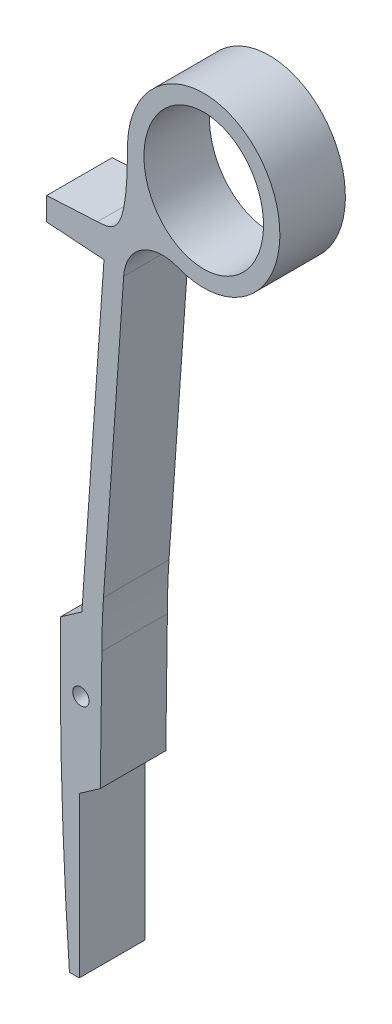
ISO-10303-21;
HEADER;
FILE_DESCRIPTION(('STEP AP214'),'2;1');
FILE_NAME('part.step','',(''),(''),'','','');
FILE_SCHEMA(('AUTOMOTIVE_DESIGN { 1 0 10303 214 1 1 1 1 }'));
ENDSEC;
DATA;
#1=APPLICATION_CONTEXT('core data for automotive mechanical design processes');
#2=APPLICATION_PROTOCOL_DEFINITION('international standard','automotive_design',2000,#1);
#3=PRODUCT_CONTEXT('',#1,'mechanical');
#4=PRODUCT('Part','Part','',(#3));
#5=PRODUCT_RELATED_PRODUCT_CATEGORY('part','',(#4));
#6=PRODUCT_DEFINITION_FORMATION('','',#4);
#7=PRODUCT_DEFINITION_CONTEXT('part definition',#1,'design');
#8=PRODUCT_DEFINITION('design','',#6,#7);
#9=PRODUCT_DEFINITION_SHAPE('','',#8);
#10=(LENGTH_UNIT() NAMED_UNIT(*) SI_UNIT(.MILLI.,.METRE.));
#11=(NAMED_UNIT(*) PLANE_ANGLE_UNIT() SI_UNIT($,.RADIAN.));
#12=(NAMED_UNIT(*) SI_UNIT($,.STERADIAN.) SOLID_ANGLE_UNIT());
#13=UNCERTAINTY_MEASURE_WITH_UNIT(LENGTH_MEASURE(1.E-05),#10,'distance_accuracy_value','');
#14=(GEOMETRIC_REPRESENTATION_CONTEXT(3) GLOBAL_UNCERTAINTY_ASSIGNED_CONTEXT((#13)) GLOBAL_UNIT_ASSIGNED_CONTEXT((#10,
#11,#12)) REPRESENTATION_CONTEXT('',''));
#15=CARTESIAN_POINT('',(0.,0.,0.));
#16=DIRECTION('',(0.,0.,1.));
#17=DIRECTION('',(1.,0.,0.));
#18=AXIS2_PLACEMENT_3D('',#15,#16,#17);
#19=CARTESIAN_POINT('',(104.702096709402,7.7197179149706,5.));
#20=DIRECTION('',(0.,0.,1.));
#21=DIRECTION('',(1.,0.,0.));
#22=AXIS2_PLACEMENT_3D('',#19,#20,#21);
#23=PLANE('',#22);
#24=DIRECTION('',(-0.0697564737441319,-0.997564050259824,0.));
#25=VECTOR('',#24,1.);
#26=CARTESIAN_POINT('',(0.15,11.25,5.));
#27=LINE('',#26,#25);
#28=CARTESIAN_POINT('',(3.5239686762747,59.5,5.));
#29=VERTEX_POINT('',#28);
#30=CARTESIAN_POINT('',(0.15,11.25,5.));
#31=VERTEX_POINT('',#30);
#32=EDGE_CURVE('E86',#29,#31,#27,.T.);
#33=ORIENTED_EDGE('',*,*,#32,.T.);
#34=DIRECTION('',(-0.819152044288993,-0.573576436351045,0.));
#35=VECTOR('',#34,1.);
#36=CARTESIAN_POINT('',(0.15,11.25,5.));
#37=LINE('',#36,#35);
#38=CARTESIAN_POINT('',(-3.12660817715597,8.95569425459582,5.));
#39=VERTEX_POINT('',#38);
#40=EDGE_CURVE('E307',#31,#39,#37,.T.);
#41=ORIENTED_EDGE('',*,*,#40,.T.);
#42=CARTESIAN_POINT('',(581.844808585837,3.17282556363065,5.));
#43=DIRECTION('',(0.,0.,1.));
#44=DIRECTION('',(1.,0.,0.));
#45=AXIS2_PLACEMENT_3D('',#42,#43,#44);
#46=CIRCLE('',#45,585.);
#47=CARTESIAN_POINT('',(-1.74999999999992,-37.3499999999998,5.));
#48=VERTEX_POINT('',#47);
#49=EDGE_CURVE('E312',#39,#48,#46,.T.);
#50=ORIENTED_EDGE('',*,*,#49,.T.);
#51=DIRECTION('',(1.,0.,0.));
#52=VECTOR('',#51,1.);
#53=CARTESIAN_POINT('',(-1.74999999999999,-37.35,5.));
#54=LINE('',#53,#52);
#55=CARTESIAN_POINT('',(-0.249999999999994,-37.35,5.));
#56=VERTEX_POINT('',#55);
#57=EDGE_CURVE('E315',#48,#56,#54,.T.);
#58=ORIENTED_EDGE('',*,*,#57,.T.);
#59=DIRECTION('',(0.,1.,0.));
#60=VECTOR('',#59,1.);
#61=CARTESIAN_POINT('',(-0.249999999999994,-37.35,5.));
#62=LINE('',#61,#60);
#63=CARTESIAN_POINT('',(-0.25,-12.95,5.));
#64=VERTEX_POINT('',#63);
#65=EDGE_CURVE('E323',#56,#64,#62,.T.);
#66=ORIENTED_EDGE('',*,*,#65,.T.);
#67=DIRECTION('',(0.819152044288993,0.573576436351045,0.));
#68=VECTOR('',#67,1.);
#69=CARTESIAN_POINT('',(-0.25,-12.95,5.));
#70=LINE('',#69,#68);
#71=CARTESIAN_POINT('',(2.96333301516977,-10.7,5.));
#72=VERTEX_POINT('',#71);
#73=EDGE_CURVE('E326',#64,#72,#70,.T.);
#74=ORIENTED_EDGE('',*,*,#73,.T.);
#75=DIRECTION('',(0.0130895955713436,0.999914327574007,0.));
#76=VECTOR('',#75,1.);
#77=CARTESIAN_POINT('',(2.96333301516977,-10.7,5.));
#78=LINE('',#77,#76);
#79=CARTESIAN_POINT('',(3.20223860196799,7.55000000000002,5.));
#80=VERTEX_POINT('',#79);
#81=EDGE_CURVE('E313',#72,#80,#78,.T.);
#82=ORIENTED_EDGE('',*,*,#81,.T.);
#83=CARTESIAN_POINT('',(104.702096709402,7.7197179149706,5.));
#84=DIRECTION('',(0.,0.,-1.));
#85=DIRECTION('',(1.,0.,0.));
#86=AXIS2_PLACEMENT_3D('',#83,#84,#85);
#87=CIRCLE('',#86,101.5);
#88=CARTESIAN_POINT('',(3.44934560803037,14.8,5.));
#89=VERTEX_POINT('',#88);
#90=EDGE_CURVE('E134',#80,#89,#87,.T.);
#91=ORIENTED_EDGE('',*,*,#90,.T.);
#92=DIRECTION('',(0.0697564737441319,0.997564050259824,0.));
#93=VECTOR('',#92,1.);
#94=CARTESIAN_POINT('',(3.44934560803037,14.8,5.));
#95=LINE('',#94,#93);
#96=CARTESIAN_POINT('',(6.52612533354514,58.8,5.));
#97=VERTEX_POINT('',#96);
#98=EDGE_CURVE('E225',#89,#97,#95,.T.);
#99=ORIENTED_EDGE('',*,*,#98,.T.);
#100=CARTESIAN_POINT('',(6.52612533354514,58.8,5.));
#101=CARTESIAN_POINT('',(6.82840338643638,63.1227775511259,5.));
#102=CARTESIAN_POINT('',(10.8461779327053,65.6745127967912,5.));
#103=CARTESIAN_POINT('',(14.8856677947411,64.1059786300332,5.));
#104=B_SPLINE_CURVE_WITH_KNOTS('',3,(#100,#101,#102,#103),.UNSPECIFIED.,.F.,.F.,(4,4),(0.,1.),.UNSPECIFIED.);
#105=CARTESIAN_POINT('',(14.8856677947411,64.1059786300332,5.));
#106=VERTEX_POINT('',#105);
#107=EDGE_CURVE('E244',#97,#106,#104,.T.);
#108=ORIENTED_EDGE('',*,*,#107,.T.);
#109=CARTESIAN_POINT('',(18.75,76.25,5.));
#110=DIRECTION('',(0.,0.,1.));
#111=DIRECTION('',(0.,-1.,0.));
#112=AXIS2_PLACEMENT_3D('',#109,#110,#111);
#113=ELLIPSE('',#112,12.8762556435129,11.625);
#114=CARTESIAN_POINT('',(7.12499999999999,76.25,5.));
#115=VERTEX_POINT('',#114);
#116=EDGE_CURVE('E241',#106,#115,#113,.T.);
#117=ORIENTED_EDGE('',*,*,#116,.T.);
#118=CARTESIAN_POINT('',(7.12499999999999,76.25,5.));
#119=CARTESIAN_POINT('',(7.12499999999999,64.25,5.));
#120=CARTESIAN_POINT('',(5.18698076895356,64.1575824439305,5.));
#121=CARTESIAN_POINT('',(2.5239686762747,64.0180198939493,5.));
#122=B_SPLINE_CURVE_WITH_KNOTS('',3,(#118,#119,#120,#121),.UNSPECIFIED.,.F.,.F.,(4,4),(0.,1.),.UNSPECIFIED.);
#123=CARTESIAN_POINT('',(2.5239686762747,64.0180198939493,5.));
#124=VERTEX_POINT('',#123);
#125=EDGE_CURVE('E243',#115,#124,#122,.T.);
#126=ORIENTED_EDGE('',*,*,#125,.T.);
#127=DIRECTION('',(-0.998629534754574,-0.0523359562429402,0.));
#128=VECTOR('',#127,1.);
#129=CARTESIAN_POINT('',(-5.2260313237253,63.6118596045058,5.));
#130=LINE('',#129,#128);
#131=CARTESIAN_POINT('',(-5.2260313237253,63.6118596045058,5.));
#132=VERTEX_POINT('',#131);
#133=EDGE_CURVE('E162',#124,#132,#130,.T.);
#134=ORIENTED_EDGE('',*,*,#133,.T.);
#135=DIRECTION('',(0.,-1.,0.));
#136=VECTOR('',#135,1.);
#137=CARTESIAN_POINT('',(-5.2260313237253,60.1118596045058,5.));
#138=LINE('',#137,#136);
#139=CARTESIAN_POINT('',(-5.2260313237253,60.1118596045058,5.));
#140=VERTEX_POINT('',#139);
#141=EDGE_CURVE('E157',#132,#140,#138,.T.);
#142=ORIENTED_EDGE('',*,*,#141,.T.);
#143=DIRECTION('',(0.997564050259824,-0.0697564737441315,0.));
#144=VECTOR('',#143,1.);
#145=CARTESIAN_POINT('',(3.5239686762747,59.5,5.));
#146=LINE('',#145,#144);
#147=EDGE_CURVE('E160',#140,#29,#146,.T.);
#148=ORIENTED_EDGE('',*,*,#147,.T.);
#149=EDGE_LOOP('',(#33,#41,#50,#58,#66,#74,#82,#91,#99,#108,#117,#126,#134,#142,#148));
#150=FACE_BOUND('',#149,.T.);
#151=CARTESIAN_POINT('',(18.75,76.25,5.));
#152=DIRECTION('',(0.,0.,1.));
#153=DIRECTION('',(0.,-1.,0.));
#154=AXIS2_PLACEMENT_3D('',#151,#152,#153);
#155=ELLIPSE('',#154,10.375,9.125);
#156=CARTESIAN_POINT('',(18.75,65.875,5.));
#157=VERTEX_POINT('',#156);
#158=EDGE_CURVE('E179',#157,#157,#155,.T.);
#159=ORIENTED_EDGE('',*,*,#158,.F.);
#160=EDGE_LOOP('',(#159));
#161=FACE_BOUND('',#160,.T.);
#162=CARTESIAN_POINT('',(0.,0.,5.));
#163=DIRECTION('',(0.,0.,1.));
#164=DIRECTION('',(1.,0.,0.));
#165=AXIS2_PLACEMENT_3D('',#162,#163,#164);
#166=CIRCLE('',#165,1.25);
#167=CARTESIAN_POINT('',(1.25,0.,5.));
#168=VERTEX_POINT('',#167);
#169=EDGE_CURVE('E333',#168,#168,#166,.T.);
#170=ORIENTED_EDGE('',*,*,#169,.F.);
#171=EDGE_LOOP('',(#170));
#172=FACE_BOUND('',#171,.T.);
#173=ADVANCED_FACE('F69',(#150,#161,#172),#23,.T.);
#174=CARTESIAN_POINT('',(104.702096709402,7.7197179149706,-5.));
#175=DIRECTION('',(0.,0.,1.));
#176=DIRECTION('',(1.,0.,0.));
#177=AXIS2_PLACEMENT_3D('',#174,#175,#176);
#178=PLANE('',#177);
#179=CARTESIAN_POINT('',(104.702096709402,7.7197179149706,-5.));
#180=DIRECTION('',(0.,0.,-1.));
#181=DIRECTION('',(1.,0.,0.));
#182=AXIS2_PLACEMENT_3D('',#179,#180,#181);
#183=CIRCLE('',#182,101.5);
#184=CARTESIAN_POINT('',(3.20223860196799,7.55000000000002,-5.));
#185=VERTEX_POINT('',#184);
#186=CARTESIAN_POINT('',(3.44934560803037,14.8,-5.));
#187=VERTEX_POINT('',#186);
#188=EDGE_CURVE('E176',#185,#187,#183,.T.);
#189=ORIENTED_EDGE('',*,*,#188,.F.);
#190=DIRECTION('',(0.0130895955713436,0.999914327574007,0.));
#191=VECTOR('',#190,1.);
#192=CARTESIAN_POINT('',(2.96333301516977,-10.7,-5.));
#193=LINE('',#192,#191);
#194=CARTESIAN_POINT('',(2.96333301516977,-10.7,-5.));
#195=VERTEX_POINT('',#194);
#196=EDGE_CURVE('E330',#195,#185,#193,.T.);
#197=ORIENTED_EDGE('',*,*,#196,.F.);
#198=DIRECTION('',(0.819152044288993,0.573576436351045,0.));
#199=VECTOR('',#198,1.);
#200=CARTESIAN_POINT('',(-0.25,-12.95,-5.));
#201=LINE('',#200,#199);
#202=CARTESIAN_POINT('',(-0.25,-12.95,-5.));
#203=VERTEX_POINT('',#202);
#204=EDGE_CURVE('E317',#203,#195,#201,.T.);
#205=ORIENTED_EDGE('',*,*,#204,.F.);
#206=DIRECTION('',(0.,1.,0.));
#207=VECTOR('',#206,1.);
#208=CARTESIAN_POINT('',(-0.249999999999994,-37.35,-5.));
#209=LINE('',#208,#207);
#210=CARTESIAN_POINT('',(-0.249999999999994,-37.35,-5.));
#211=VERTEX_POINT('',#210);
#212=EDGE_CURVE('E341',#211,#203,#209,.T.);
#213=ORIENTED_EDGE('',*,*,#212,.F.);
#214=DIRECTION('',(1.,0.,0.));
#215=VECTOR('',#214,1.);
#216=CARTESIAN_POINT('',(-1.74999999999999,-37.35,-5.));
#217=LINE('',#216,#215);
#218=CARTESIAN_POINT('',(-1.74999999999992,-37.3499999999998,-5.));
#219=VERTEX_POINT('',#218);
#220=EDGE_CURVE('E338',#219,#211,#217,.T.);
#221=ORIENTED_EDGE('',*,*,#220,.F.);
#222=CARTESIAN_POINT('',(581.844808585837,3.17282556363065,-5.));
#223=DIRECTION('',(0.,0.,1.));
#224=DIRECTION('',(1.,0.,0.));
#225=AXIS2_PLACEMENT_3D('',#222,#223,#224);
#226=CIRCLE('',#225,585.);
#227=CARTESIAN_POINT('',(-3.12660817715597,8.95569425459582,-5.));
#228=VERTEX_POINT('',#227);
#229=EDGE_CURVE('E335',#228,#219,#226,.T.);
#230=ORIENTED_EDGE('',*,*,#229,.F.);
#231=DIRECTION('',(-0.819152044288993,-0.573576436351045,0.));
#232=VECTOR('',#231,1.);
#233=CARTESIAN_POINT('',(0.15,11.25,-5.));
#234=LINE('',#233,#232);
#235=CARTESIAN_POINT('',(0.15,11.25,-5.));
#236=VERTEX_POINT('',#235);
#237=EDGE_CURVE('E299',#236,#228,#234,.T.);
#238=ORIENTED_EDGE('',*,*,#237,.F.);
#239=DIRECTION('',(-0.0697564737441319,-0.997564050259824,0.));
#240=VECTOR('',#239,1.);
#241=CARTESIAN_POINT('',(0.15,11.25,-5.));
#242=LINE('',#241,#240);
#243=CARTESIAN_POINT('',(3.5239686762747,59.5,-5.));
#244=VERTEX_POINT('',#243);
#245=EDGE_CURVE('E201',#244,#236,#242,.T.);
#246=ORIENTED_EDGE('',*,*,#245,.F.);
#247=DIRECTION('',(0.997564050259824,-0.0697564737441315,0.));
#248=VECTOR('',#247,1.);
#249=CARTESIAN_POINT('',(3.5239686762747,59.5,-5.));
#250=LINE('',#249,#248);
#251=CARTESIAN_POINT('',(-5.2260313237253,60.1118596045058,-5.));
#252=VERTEX_POINT('',#251);
#253=EDGE_CURVE('E126',#252,#244,#250,.T.);
#254=ORIENTED_EDGE('',*,*,#253,.F.);
#255=DIRECTION('',(0.,-1.,0.));
#256=VECTOR('',#255,1.);
#257=CARTESIAN_POINT('',(-5.2260313237253,60.1118596045058,-5.));
#258=LINE('',#257,#256);
#259=CARTESIAN_POINT('',(-5.2260313237253,63.6118596045058,-5.));
#260=VERTEX_POINT('',#259);
#261=EDGE_CURVE('E119',#260,#252,#258,.T.);
#262=ORIENTED_EDGE('',*,*,#261,.F.);
#263=DIRECTION('',(-0.998629534754574,-0.0523359562429402,0.));
#264=VECTOR('',#263,1.);
#265=CARTESIAN_POINT('',(-5.2260313237253,63.6118596045058,-5.));
#266=LINE('',#265,#264);
#267=CARTESIAN_POINT('',(2.5239686762747,64.0180198939493,-5.));
#268=VERTEX_POINT('',#267);
#269=EDGE_CURVE('E194',#268,#260,#266,.T.);
#270=ORIENTED_EDGE('',*,*,#269,.F.);
#271=CARTESIAN_POINT('',(7.12499999999999,76.25,-5.));
#272=CARTESIAN_POINT('',(7.12499999999999,64.25,-5.));
#273=CARTESIAN_POINT('',(5.18698076895356,64.1575824439305,-5.));
#274=CARTESIAN_POINT('',(2.5239686762747,64.0180198939493,-5.));
#275=B_SPLINE_CURVE_WITH_KNOTS('',3,(#271,#272,#273,#274),.UNSPECIFIED.,.F.,.F.,(4,4),(0.,1.),.UNSPECIFIED.);
#276=CARTESIAN_POINT('',(7.12499999999999,76.25,-5.));
#277=VERTEX_POINT('',#276);
#278=EDGE_CURVE('E190',#277,#268,#275,.T.);
#279=ORIENTED_EDGE('',*,*,#278,.F.);
#280=CARTESIAN_POINT('',(18.75,76.25,-5.));
#281=DIRECTION('',(0.,0.,1.));
#282=DIRECTION('',(0.,-1.,0.));
#283=AXIS2_PLACEMENT_3D('',#280,#281,#282);
#284=ELLIPSE('',#283,12.8762556435129,11.625);
#285=CARTESIAN_POINT('',(14.8856677947411,64.1059786300332,-5.));
#286=VERTEX_POINT('',#285);
#287=EDGE_CURVE('E185',#286,#277,#284,.T.);
#288=ORIENTED_EDGE('',*,*,#287,.F.);
#289=CARTESIAN_POINT('',(6.52612533354514,58.8,-5.));
#290=CARTESIAN_POINT('',(6.82840338643638,63.1227775511259,-5.));
#291=CARTESIAN_POINT('',(10.8461779327053,65.6745127967912,-5.));
#292=CARTESIAN_POINT('',(14.8856677947411,64.1059786300332,-5.));
#293=B_SPLINE_CURVE_WITH_KNOTS('',3,(#289,#290,#291,#292),.UNSPECIFIED.,.F.,.F.,(4,4),(0.,1.),.UNSPECIFIED.);
#294=CARTESIAN_POINT('',(6.52612533354514,58.8,-5.));
#295=VERTEX_POINT('',#294);
#296=EDGE_CURVE('E181',#295,#286,#293,.T.);
#297=ORIENTED_EDGE('',*,*,#296,.F.);
#298=DIRECTION('',(0.0697564737441319,0.997564050259824,0.));
#299=VECTOR('',#298,1.);
#300=CARTESIAN_POINT('',(3.44934560803037,14.8,-5.));
#301=LINE('',#300,#299);
#302=EDGE_CURVE('E178',#187,#295,#301,.T.);
#303=ORIENTED_EDGE('',*,*,#302,.F.);
#304=EDGE_LOOP('',(#189,#197,#205,#213,#221,#230,#238,#246,#254,#262,#270,#279,#288,#297,#303));
#305=FACE_BOUND('',#304,.T.);
#306=CARTESIAN_POINT('',(18.75,76.25,-5.));
#307=DIRECTION('',(0.,0.,1.));
#308=DIRECTION('',(0.,-1.,0.));
#309=AXIS2_PLACEMENT_3D('',#306,#307,#308);
#310=ELLIPSE('',#309,10.375,9.125);
#311=CARTESIAN_POINT('',(18.75,65.875,-5.));
#312=VERTEX_POINT('',#311);
#313=EDGE_CURVE('E357',#312,#312,#310,.T.);
#314=ORIENTED_EDGE('',*,*,#313,.T.);
#315=EDGE_LOOP('',(#314));
#316=FACE_BOUND('',#315,.T.);
#317=CARTESIAN_POINT('',(0.,0.,-5.));
#318=DIRECTION('',(0.,0.,1.));
#319=DIRECTION('',(1.,0.,0.));
#320=AXIS2_PLACEMENT_3D('',#317,#318,#319);
#321=CIRCLE('',#320,1.25);
#322=CARTESIAN_POINT('',(1.25,0.,-5.));
#323=VERTEX_POINT('',#322);
#324=EDGE_CURVE('E428',#323,#323,#321,.T.);
#325=ORIENTED_EDGE('',*,*,#324,.T.);
#326=EDGE_LOOP('',(#325));
#327=FACE_BOUND('',#326,.T.);
#328=ADVANCED_FACE('F228',(#305,#316,#327),#178,.F.);
#329=CARTESIAN_POINT('',(104.702096709402,7.7197179149706,5.));
#330=DIRECTION('',(0.,0.,-1.));
#331=DIRECTION('',(-1.,0.,0.));
#332=AXIS2_PLACEMENT_3D('',#329,#330,#331);
#333=CYLINDRICAL_SURFACE('',#332,101.5);
#334=ORIENTED_EDGE('',*,*,#188,.T.);
#335=DIRECTION('',(0.,0.,-1.));
#336=VECTOR('',#335,1.);
#337=CARTESIAN_POINT('',(3.44934560803037,14.8,5.));
#338=LINE('',#337,#336);
#339=EDGE_CURVE('E78',#89,#187,#338,.T.);
#340=ORIENTED_EDGE('',*,*,#339,.F.);
#341=ORIENTED_EDGE('',*,*,#90,.F.);
#342=DIRECTION('',(0.,0.,-1.));
#343=VECTOR('',#342,1.);
#344=CARTESIAN_POINT('',(3.20223860196799,7.55000000000002,5.));
#345=LINE('',#344,#343);
#346=EDGE_CURVE('E14',#80,#185,#345,.T.);
#347=ORIENTED_EDGE('',*,*,#346,.T.);
#348=EDGE_LOOP('',(#334,#340,#341,#347));
#349=FACE_BOUND('',#348,.T.);
#350=ADVANCED_FACE('F71',(#349),#333,.F.);
#351=CARTESIAN_POINT('',(3.44934560803037,14.8,5.));
#352=DIRECTION('',(-0.997564050259824,0.069756473744132,0.));
#353=DIRECTION('',(-0.069756473744132,-0.997564050259824,0.));
#354=AXIS2_PLACEMENT_3D('',#351,#352,#353);
#355=PLANE('',#354);
#356=ORIENTED_EDGE('',*,*,#302,.T.);
#357=DIRECTION('',(0.,0.,-1.));
#358=VECTOR('',#357,1.);
#359=CARTESIAN_POINT('',(6.52612533354514,58.8,5.));
#360=LINE('',#359,#358);
#361=EDGE_CURVE('E217',#97,#295,#360,.T.);
#362=ORIENTED_EDGE('',*,*,#361,.F.);
#363=ORIENTED_EDGE('',*,*,#98,.F.);
#364=ORIENTED_EDGE('',*,*,#339,.T.);
#365=EDGE_LOOP('',(#356,#362,#363,#364));
#366=FACE_BOUND('',#365,.T.);
#367=ADVANCED_FACE('F223',(#366),#355,.F.);
#368=DIRECTION('',(0.,0.,-1.));
#369=VECTOR('',#368,1.);
#370=SURFACE_OF_LINEAR_EXTRUSION('',#104,#369);
#371=ORIENTED_EDGE('',*,*,#296,.T.);
#372=DIRECTION('',(0.,0.,-1.));
#373=VECTOR('',#372,1.);
#374=CARTESIAN_POINT('',(14.8856677947411,64.1059786300332,5.));
#375=LINE('',#374,#373);
#376=EDGE_CURVE('E214',#106,#286,#375,.T.);
#377=ORIENTED_EDGE('',*,*,#376,.F.);
#378=ORIENTED_EDGE('',*,*,#107,.F.);
#379=ORIENTED_EDGE('',*,*,#361,.T.);
#380=EDGE_LOOP('',(#371,#377,#378,#379));
#381=FACE_BOUND('',#380,.T.);
#382=ADVANCED_FACE('F235',(#381),#370,.F.);
#383=DIRECTION('',(0.,0.,-1.));
#384=VECTOR('',#383,1.);
#385=SURFACE_OF_LINEAR_EXTRUSION('',#113,#384);
#386=ORIENTED_EDGE('',*,*,#287,.T.);
#387=DIRECTION('',(0.,0.,-1.));
#388=VECTOR('',#387,1.);
#389=CARTESIAN_POINT('',(7.12499999999999,76.25,5.));
#390=LINE('',#389,#388);
#391=EDGE_CURVE('E211',#115,#277,#390,.T.);
#392=ORIENTED_EDGE('',*,*,#391,.F.);
#393=ORIENTED_EDGE('',*,*,#116,.F.);
#394=ORIENTED_EDGE('',*,*,#376,.T.);
#395=EDGE_LOOP('',(#386,#392,#393,#394));
#396=FACE_BOUND('',#395,.T.);
#397=ADVANCED_FACE('F239',(#396),#385,.F.);
#398=DIRECTION('',(0.,0.,-1.));
#399=VECTOR('',#398,1.);
#400=SURFACE_OF_LINEAR_EXTRUSION('',#122,#399);
#401=ORIENTED_EDGE('',*,*,#278,.T.);
#402=DIRECTION('',(0.,0.,-1.));
#403=VECTOR('',#402,1.);
#404=CARTESIAN_POINT('',(2.5239686762747,64.0180198939493,5.));
#405=LINE('',#404,#403);
#406=EDGE_CURVE('E208',#124,#268,#405,.T.);
#407=ORIENTED_EDGE('',*,*,#406,.F.);
#408=ORIENTED_EDGE('',*,*,#125,.F.);
#409=ORIENTED_EDGE('',*,*,#391,.T.);
#410=EDGE_LOOP('',(#401,#407,#408,#409));
#411=FACE_BOUND('',#410,.T.);
#412=ADVANCED_FACE('F260',(#411),#400,.F.);
#413=CARTESIAN_POINT('',(-5.2260313237253,63.6118596045058,5.));
#414=DIRECTION('',(0.0523359562429402,-0.998629534754574,0.));
#415=DIRECTION('',(0.998629534754574,0.0523359562429402,0.));
#416=AXIS2_PLACEMENT_3D('',#413,#414,#415);
#417=PLANE('',#416);
#418=ORIENTED_EDGE('',*,*,#269,.T.);
#419=DIRECTION('',(0.,0.,-1.));
#420=VECTOR('',#419,1.);
#421=CARTESIAN_POINT('',(-5.2260313237253,63.6118596045058,5.));
#422=LINE('',#421,#420);
#423=EDGE_CURVE('E167',#132,#260,#422,.T.);
#424=ORIENTED_EDGE('',*,*,#423,.F.);
#425=ORIENTED_EDGE('',*,*,#133,.F.);
#426=ORIENTED_EDGE('',*,*,#406,.T.);
#427=EDGE_LOOP('',(#418,#424,#425,#426));
#428=FACE_BOUND('',#427,.T.);
#429=ADVANCED_FACE('F285',(#428),#417,.F.);
#430=CARTESIAN_POINT('',(-5.2260313237253,60.1118596045058,5.));
#431=DIRECTION('',(1.,0.,0.));
#432=DIRECTION('',(0.,1.,0.));
#433=AXIS2_PLACEMENT_3D('',#430,#431,#432);
#434=PLANE('',#433);
#435=ORIENTED_EDGE('',*,*,#261,.T.);
#436=DIRECTION('',(0.,0.,-1.));
#437=VECTOR('',#436,1.);
#438=CARTESIAN_POINT('',(-5.2260313237253,60.1118596045058,5.));
#439=LINE('',#438,#437);
#440=EDGE_CURVE('E165',#140,#252,#439,.T.);
#441=ORIENTED_EDGE('',*,*,#440,.F.);
#442=ORIENTED_EDGE('',*,*,#141,.F.);
#443=ORIENTED_EDGE('',*,*,#423,.T.);
#444=EDGE_LOOP('',(#435,#441,#442,#443));
#445=FACE_BOUND('',#444,.T.);
#446=ADVANCED_FACE('F166',(#445),#434,.F.);
#447=CARTESIAN_POINT('',(3.5239686762747,59.5,5.));
#448=DIRECTION('',(0.0697564737441315,0.997564050259824,0.));
#449=DIRECTION('',(-0.997564050259824,0.0697564737441315,0.));
#450=AXIS2_PLACEMENT_3D('',#447,#448,#449);
#451=PLANE('',#450);
#452=ORIENTED_EDGE('',*,*,#253,.T.);
#453=DIRECTION('',(0.,0.,-1.));
#454=VECTOR('',#453,1.);
#455=CARTESIAN_POINT('',(3.5239686762747,59.5,5.));
#456=LINE('',#455,#454);
#457=EDGE_CURVE('E168',#29,#244,#456,.T.);
#458=ORIENTED_EDGE('',*,*,#457,.F.);
#459=ORIENTED_EDGE('',*,*,#147,.F.);
#460=ORIENTED_EDGE('',*,*,#440,.T.);
#461=EDGE_LOOP('',(#452,#458,#459,#460));
#462=FACE_BOUND('',#461,.T.);
#463=ADVANCED_FACE('F170',(#462),#451,.F.);
#464=CARTESIAN_POINT('',(0.15,11.25,5.));
#465=DIRECTION('',(0.997564050259824,-0.0697564737441319,0.));
#466=DIRECTION('',(0.0697564737441319,0.997564050259824,0.));
#467=AXIS2_PLACEMENT_3D('',#464,#465,#466);
#468=PLANE('',#467);
#469=ORIENTED_EDGE('',*,*,#245,.T.);
#470=DIRECTION('',(0.,0.,-1.));
#471=VECTOR('',#470,1.);
#472=CARTESIAN_POINT('',(0.15,11.25,5.));
#473=LINE('',#472,#471);
#474=EDGE_CURVE('E172',#31,#236,#473,.T.);
#475=ORIENTED_EDGE('',*,*,#474,.F.);
#476=ORIENTED_EDGE('',*,*,#32,.F.);
#477=ORIENTED_EDGE('',*,*,#457,.T.);
#478=EDGE_LOOP('',(#469,#475,#476,#477));
#479=FACE_BOUND('',#478,.T.);
#480=ADVANCED_FACE('F278',(#479),#468,.F.);
#481=DIRECTION('',(0.,0.,-1.));
#482=VECTOR('',#481,1.);
#483=SURFACE_OF_LINEAR_EXTRUSION('',#155,#482);
#484=ORIENTED_EDGE('',*,*,#158,.T.);
#485=EDGE_LOOP('',(#484));
#486=FACE_BOUND('',#485,.T.);
#487=ORIENTED_EDGE('',*,*,#313,.F.);
#488=EDGE_LOOP('',(#487));
#489=FACE_BOUND('',#488,.T.);
#490=ADVANCED_FACE('F274',(#486,#489),#483,.T.);
#491=CARTESIAN_POINT('',(2.96333301516977,-10.7,5.));
#492=DIRECTION('',(-0.999914327574007,0.0130895955713436,0.));
#493=DIRECTION('',(-0.0130895955713436,-0.999914327574007,0.));
#494=AXIS2_PLACEMENT_3D('',#491,#492,#493);
#495=PLANE('',#494);
#496=ORIENTED_EDGE('',*,*,#196,.T.);
#497=ORIENTED_EDGE('',*,*,#346,.F.);
#498=ORIENTED_EDGE('',*,*,#81,.F.);
#499=DIRECTION('',(0.,0.,-1.));
#500=VECTOR('',#499,1.);
#501=CARTESIAN_POINT('',(2.96333301516977,-10.7,5.));
#502=LINE('',#501,#500);
#503=EDGE_CURVE('E329',#72,#195,#502,.T.);
#504=ORIENTED_EDGE('',*,*,#503,.T.);
#505=EDGE_LOOP('',(#496,#497,#498,#504));
#506=FACE_BOUND('',#505,.T.);
#507=ADVANCED_FACE('F368',(#506),#495,.F.);
#508=CARTESIAN_POINT('',(0.15,11.25,5.));
#509=DIRECTION('',(0.573576436351045,-0.819152044288993,0.));
#510=DIRECTION('',(0.819152044288993,0.573576436351045,0.));
#511=AXIS2_PLACEMENT_3D('',#508,#509,#510);
#512=PLANE('',#511);
#513=ORIENTED_EDGE('',*,*,#237,.T.);
#514=DIRECTION('',(0.,0.,-1.));
#515=VECTOR('',#514,1.);
#516=CARTESIAN_POINT('',(-3.12660817715597,8.95569425459582,5.));
#517=LINE('',#516,#515);
#518=EDGE_CURVE('E309',#39,#228,#517,.T.);
#519=ORIENTED_EDGE('',*,*,#518,.F.);
#520=ORIENTED_EDGE('',*,*,#40,.F.);
#521=ORIENTED_EDGE('',*,*,#474,.T.);
#522=EDGE_LOOP('',(#513,#519,#520,#521));
#523=FACE_BOUND('',#522,.T.);
#524=ADVANCED_FACE('F304',(#523),#512,.F.);
#525=CARTESIAN_POINT('',(581.844808585837,3.17282556363065,5.));
#526=DIRECTION('',(0.,0.,-1.));
#527=DIRECTION('',(-1.,0.,0.));
#528=AXIS2_PLACEMENT_3D('',#525,#526,#527);
#529=CYLINDRICAL_SURFACE('',#528,585.);
#530=ORIENTED_EDGE('',*,*,#229,.T.);
#531=DIRECTION('',(0.,0.,-1.));
#532=VECTOR('',#531,1.);
#533=CARTESIAN_POINT('',(-1.74999999999992,-37.3499999999998,5.));
#534=LINE('',#533,#532);
#535=EDGE_CURVE('E354',#48,#219,#534,.T.);
#536=ORIENTED_EDGE('',*,*,#535,.F.);
#537=ORIENTED_EDGE('',*,*,#49,.F.);
#538=ORIENTED_EDGE('',*,*,#518,.T.);
#539=EDGE_LOOP('',(#530,#536,#537,#538));
#540=FACE_BOUND('',#539,.T.);
#541=ADVANCED_FACE('F392',(#540),#529,.T.);
#542=CARTESIAN_POINT('',(-1.74999999999999,-37.35,5.));
#543=DIRECTION('',(0.,1.,0.));
#544=DIRECTION('',(0.,0.,1.));
#545=AXIS2_PLACEMENT_3D('',#542,#543,#544);
#546=PLANE('',#545);
#547=ORIENTED_EDGE('',*,*,#220,.T.);
#548=DIRECTION('',(0.,0.,-1.));
#549=VECTOR('',#548,1.);
#550=CARTESIAN_POINT('',(-0.249999999999994,-37.35,5.));
#551=LINE('',#550,#549);
#552=EDGE_CURVE('E351',#56,#211,#551,.T.);
#553=ORIENTED_EDGE('',*,*,#552,.F.);
#554=ORIENTED_EDGE('',*,*,#57,.F.);
#555=ORIENTED_EDGE('',*,*,#535,.T.);
#556=EDGE_LOOP('',(#547,#553,#554,#555));
#557=FACE_BOUND('',#556,.T.);
#558=ADVANCED_FACE('F395',(#557),#546,.F.);
#559=CARTESIAN_POINT('',(-0.249999999999994,-37.35,5.));
#560=DIRECTION('',(-1.,0.,0.));
#561=DIRECTION('',(0.,-1.,0.));
#562=AXIS2_PLACEMENT_3D('',#559,#560,#561);
#563=PLANE('',#562);
#564=ORIENTED_EDGE('',*,*,#212,.T.);
#565=DIRECTION('',(0.,0.,-1.));
#566=VECTOR('',#565,1.);
#567=CARTESIAN_POINT('',(-0.25,-12.95,5.));
#568=LINE('',#567,#566);
#569=EDGE_CURVE('E348',#64,#203,#568,.T.);
#570=ORIENTED_EDGE('',*,*,#569,.F.);
#571=ORIENTED_EDGE('',*,*,#65,.F.);
#572=ORIENTED_EDGE('',*,*,#552,.T.);
#573=EDGE_LOOP('',(#564,#570,#571,#572));
#574=FACE_BOUND('',#573,.T.);
#575=ADVANCED_FACE('F397',(#574),#563,.F.);
#576=CARTESIAN_POINT('',(-0.25,-12.95,5.));
#577=DIRECTION('',(-0.573576436351045,0.819152044288993,0.));
#578=DIRECTION('',(-0.819152044288993,-0.573576436351045,0.));
#579=AXIS2_PLACEMENT_3D('',#576,#577,#578);
#580=PLANE('',#579);
#581=ORIENTED_EDGE('',*,*,#204,.T.);
#582=ORIENTED_EDGE('',*,*,#503,.F.);
#583=ORIENTED_EDGE('',*,*,#73,.F.);
#584=ORIENTED_EDGE('',*,*,#569,.T.);
#585=EDGE_LOOP('',(#581,#582,#583,#584));
#586=FACE_BOUND('',#585,.T.);
#587=ADVANCED_FACE('F398',(#586),#580,.F.);
#588=CARTESIAN_POINT('',(0.,0.,5.));
#589=DIRECTION('',(0.,0.,-1.));
#590=DIRECTION('',(-1.,0.,0.));
#591=AXIS2_PLACEMENT_3D('',#588,#589,#590);
#592=CYLINDRICAL_SURFACE('',#591,1.25);
#593=ORIENTED_EDGE('',*,*,#169,.T.);
#594=EDGE_LOOP('',(#593));
#595=FACE_BOUND('',#594,.T.);
#596=ORIENTED_EDGE('',*,*,#324,.F.);
#597=EDGE_LOOP('',(#596));
#598=FACE_BOUND('',#597,.T.);
#599=ADVANCED_FACE('F400',(#595,#598),#592,.F.);
#600=CLOSED_SHELL('',(#173,#328,#350,#367,#382,#397,#412,#429,#446,#463,#480,#490,#507,#524,
#541,#558,#575,#587,#599));
#601=MANIFOLD_SOLID_BREP('B2',#600);
#602=ADVANCED_BREP_SHAPE_REPRESENTATION('',(#18,#601),#14);
#603=SHAPE_DEFINITION_REPRESENTATION(#9,#602);
ENDSEC;
END-ISO-10303-21;
